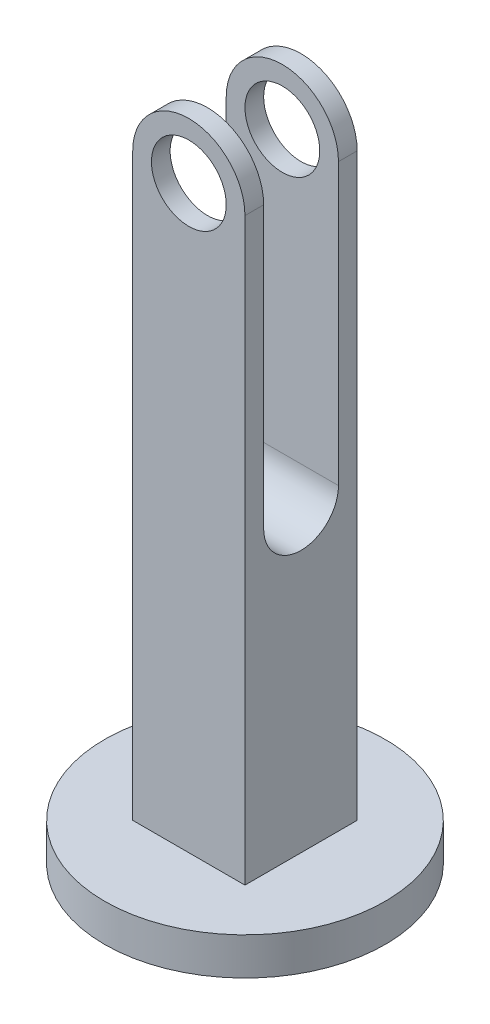
ISO-10303-21;
HEADER;
FILE_DESCRIPTION(('STEP AP214'),'2;1');
FILE_NAME('part.step','',(''),(''),'','','');
FILE_SCHEMA(('AUTOMOTIVE_DESIGN { 1 0 10303 214 1 1 1 1 }'));
ENDSEC;
DATA;
#1=APPLICATION_CONTEXT('core data for automotive mechanical design processes');
#2=APPLICATION_PROTOCOL_DEFINITION('international standard','automotive_design',2000,#1);
#3=PRODUCT_CONTEXT('',#1,'mechanical');
#4=PRODUCT('Part','Part','',(#3));
#5=PRODUCT_RELATED_PRODUCT_CATEGORY('part','',(#4));
#6=PRODUCT_DEFINITION_FORMATION('','',#4);
#7=PRODUCT_DEFINITION_CONTEXT('part definition',#1,'design');
#8=PRODUCT_DEFINITION('design','',#6,#7);
#9=PRODUCT_DEFINITION_SHAPE('','',#8);
#10=(LENGTH_UNIT() NAMED_UNIT(*) SI_UNIT(.MILLI.,.METRE.));
#11=(NAMED_UNIT(*) PLANE_ANGLE_UNIT() SI_UNIT($,.RADIAN.));
#12=(NAMED_UNIT(*) SI_UNIT($,.STERADIAN.) SOLID_ANGLE_UNIT());
#13=UNCERTAINTY_MEASURE_WITH_UNIT(LENGTH_MEASURE(1.E-05),#10,'distance_accuracy_value','');
#14=(GEOMETRIC_REPRESENTATION_CONTEXT(3) GLOBAL_UNCERTAINTY_ASSIGNED_CONTEXT((#13)) GLOBAL_UNIT_ASSIGNED_CONTEXT((#10,
#11,#12)) REPRESENTATION_CONTEXT('',''));
#15=CARTESIAN_POINT('',(0.,0.,0.));
#16=DIRECTION('',(0.,0.,1.));
#17=DIRECTION('',(1.,0.,0.));
#18=AXIS2_PLACEMENT_3D('',#15,#16,#17);
#19=CARTESIAN_POINT('',(0.,360.,30.));
#20=DIRECTION('',(0.,0.,-1.));
#21=DIRECTION('',(-1.,0.,0.));
#22=AXIS2_PLACEMENT_3D('',#19,#20,#21);
#23=PLANE('',#22);
#24=CARTESIAN_POINT('',(0.,330.,30.));
#25=DIRECTION('',(0.,0.,1.));
#26=DIRECTION('',(1.,0.,0.));
#27=AXIS2_PLACEMENT_3D('',#24,#25,#26);
#28=CIRCLE('',#27,20.);
#29=CARTESIAN_POINT('',(20.,330.,30.));
#30=VERTEX_POINT('',#29);
#31=EDGE_CURVE('E190',#30,#30,#28,.T.);
#32=ORIENTED_EDGE('',*,*,#31,.F.);
#33=EDGE_LOOP('',(#32));
#34=FACE_BOUND('',#33,.T.);
#35=CARTESIAN_POINT('',(0.,330.,30.));
#36=DIRECTION('',(0.,0.,1.));
#37=DIRECTION('',(1.,0.,0.));
#38=AXIS2_PLACEMENT_3D('',#35,#36,#37);
#39=CIRCLE('',#38,30.);
#40=CARTESIAN_POINT('',(-30.,330.,30.));
#41=VERTEX_POINT('',#40);
#42=CARTESIAN_POINT('',(30.,330.,30.));
#43=VERTEX_POINT('',#42);
#44=EDGE_CURVE('E142',#41,#43,#39,.F.);
#45=ORIENTED_EDGE('',*,*,#44,.F.);
#46=DIRECTION('',(0.,-1.,0.));
#47=VECTOR('',#46,1.);
#48=CARTESIAN_POINT('',(-30.,360.,30.));
#49=LINE('',#48,#47);
#50=CARTESIAN_POINT('',(-30.,20.0000000000001,30.));
#51=VERTEX_POINT('',#50);
#52=EDGE_CURVE('E146',#41,#51,#49,.T.);
#53=ORIENTED_EDGE('',*,*,#52,.T.);
#54=DIRECTION('',(1.,0.,0.));
#55=VECTOR('',#54,1.);
#56=CARTESIAN_POINT('',(-30.,20.,30.));
#57=LINE('',#56,#55);
#58=CARTESIAN_POINT('',(30.,20.,30.));
#59=VERTEX_POINT('',#58);
#60=EDGE_CURVE('E179',#51,#59,#57,.T.);
#61=ORIENTED_EDGE('',*,*,#60,.T.);
#62=DIRECTION('',(0.,-1.,0.));
#63=VECTOR('',#62,1.);
#64=CARTESIAN_POINT('',(30.,360.,30.));
#65=LINE('',#64,#63);
#66=EDGE_CURVE('E101',#43,#59,#65,.T.);
#67=ORIENTED_EDGE('',*,*,#66,.F.);
#68=EDGE_LOOP('',(#45,#53,#61,#67));
#69=FACE_BOUND('',#68,.T.);
#70=ADVANCED_FACE('F79',(#34,#69),#23,.F.);
#71=CARTESIAN_POINT('',(0.,360.,-30.));
#72=DIRECTION('',(0.,0.,-1.));
#73=DIRECTION('',(-1.,0.,0.));
#74=AXIS2_PLACEMENT_3D('',#71,#72,#73);
#75=PLANE('',#74);
#76=CARTESIAN_POINT('',(0.,330.,-30.));
#77=DIRECTION('',(0.,0.,-1.));
#78=DIRECTION('',(-1.,0.,0.));
#79=AXIS2_PLACEMENT_3D('',#76,#77,#78);
#80=CIRCLE('',#79,20.);
#81=CARTESIAN_POINT('',(-20.,330.,-30.));
#82=VERTEX_POINT('',#81);
#83=EDGE_CURVE('E194',#82,#82,#80,.T.);
#84=ORIENTED_EDGE('',*,*,#83,.F.);
#85=EDGE_LOOP('',(#84));
#86=FACE_BOUND('',#85,.T.);
#87=DIRECTION('',(0.,-1.,0.));
#88=VECTOR('',#87,1.);
#89=CARTESIAN_POINT('',(-30.,360.,-30.));
#90=LINE('',#89,#88);
#91=CARTESIAN_POINT('',(-30.,330.,-30.));
#92=VERTEX_POINT('',#91);
#93=CARTESIAN_POINT('',(-30.,20.,-30.));
#94=VERTEX_POINT('',#93);
#95=EDGE_CURVE('E162',#92,#94,#90,.T.);
#96=ORIENTED_EDGE('',*,*,#95,.F.);
#97=CARTESIAN_POINT('',(0.,330.,-30.));
#98=DIRECTION('',(0.,0.,-1.));
#99=DIRECTION('',(-1.,0.,0.));
#100=AXIS2_PLACEMENT_3D('',#97,#98,#99);
#101=CIRCLE('',#100,30.);
#102=CARTESIAN_POINT('',(30.,330.,-30.));
#103=VERTEX_POINT('',#102);
#104=EDGE_CURVE('E207',#103,#92,#101,.F.);
#105=ORIENTED_EDGE('',*,*,#104,.F.);
#106=DIRECTION('',(0.,-1.,0.));
#107=VECTOR('',#106,1.);
#108=CARTESIAN_POINT('',(30.,360.,-30.));
#109=LINE('',#108,#107);
#110=CARTESIAN_POINT('',(30.,20.,-30.));
#111=VERTEX_POINT('',#110);
#112=EDGE_CURVE('E165',#103,#111,#109,.T.);
#113=ORIENTED_EDGE('',*,*,#112,.T.);
#114=DIRECTION('',(-1.,0.,0.));
#115=VECTOR('',#114,1.);
#116=CARTESIAN_POINT('',(-30.,20.,-30.));
#117=LINE('',#116,#115);
#118=EDGE_CURVE('E175',#111,#94,#117,.T.);
#119=ORIENTED_EDGE('',*,*,#118,.T.);
#120=EDGE_LOOP('',(#96,#105,#113,#119));
#121=FACE_BOUND('',#120,.T.);
#122=ADVANCED_FACE('F243',(#86,#121),#75,.T.);
#123=CARTESIAN_POINT('',(-30.,360.,0.));
#124=DIRECTION('',(-1.,0.,0.));
#125=DIRECTION('',(0.,0.,1.));
#126=AXIS2_PLACEMENT_3D('',#123,#124,#125);
#127=PLANE('',#126);
#128=ORIENTED_EDGE('',*,*,#52,.F.);
#129=DIRECTION('',(0.,0.,1.));
#130=VECTOR('',#129,1.);
#131=CARTESIAN_POINT('',(-30.,330.,-75.));
#132=LINE('',#131,#130);
#133=CARTESIAN_POINT('',(-30.,330.,20.));
#134=VERTEX_POINT('',#133);
#135=EDGE_CURVE('E151',#134,#41,#132,.T.);
#136=ORIENTED_EDGE('',*,*,#135,.F.);
#137=DIRECTION('',(0.,1.,0.));
#138=VECTOR('',#137,1.);
#139=CARTESIAN_POINT('',(-30.,360.,20.));
#140=LINE('',#139,#138);
#141=CARTESIAN_POINT('',(-30.,180.,20.));
#142=VERTEX_POINT('',#141);
#143=EDGE_CURVE('E163',#142,#134,#140,.T.);
#144=ORIENTED_EDGE('',*,*,#143,.F.);
#145=CARTESIAN_POINT('',(-30.,180.,0.));
#146=DIRECTION('',(-1.,0.,0.));
#147=DIRECTION('',(0.,0.,1.));
#148=AXIS2_PLACEMENT_3D('',#145,#146,#147);
#149=CIRCLE('',#148,20.);
#150=CARTESIAN_POINT('',(-30.,180.,-20.));
#151=VERTEX_POINT('',#150);
#152=EDGE_CURVE('E87',#151,#142,#149,.T.);
#153=ORIENTED_EDGE('',*,*,#152,.F.);
#154=DIRECTION('',(0.,-1.,0.));
#155=VECTOR('',#154,1.);
#156=CARTESIAN_POINT('',(-30.,360.,-20.));
#157=LINE('',#156,#155);
#158=CARTESIAN_POINT('',(-30.,330.,-20.));
#159=VERTEX_POINT('',#158);
#160=EDGE_CURVE('E167',#159,#151,#157,.T.);
#161=ORIENTED_EDGE('',*,*,#160,.F.);
#162=EDGE_CURVE('E148',#92,#159,#132,.T.);
#163=ORIENTED_EDGE('',*,*,#162,.F.);
#164=ORIENTED_EDGE('',*,*,#95,.T.);
#165=DIRECTION('',(0.,0.,1.));
#166=VECTOR('',#165,1.);
#167=CARTESIAN_POINT('',(-30.,20.,30.));
#168=LINE('',#167,#166);
#169=EDGE_CURVE('E161',#94,#51,#168,.T.);
#170=ORIENTED_EDGE('',*,*,#169,.T.);
#171=EDGE_LOOP('',(#128,#136,#144,#153,#161,#163,#164,#170));
#172=FACE_BOUND('',#171,.T.);
#173=ADVANCED_FACE('F159',(#172),#127,.T.);
#174=CARTESIAN_POINT('',(-75.,360.,20.));
#175=DIRECTION('',(0.,0.,1.));
#176=DIRECTION('',(1.,0.,0.));
#177=AXIS2_PLACEMENT_3D('',#174,#175,#176);
#178=PLANE('',#177);
#179=CARTESIAN_POINT('',(0.,330.,20.));
#180=DIRECTION('',(0.,0.,1.));
#181=DIRECTION('',(1.,0.,0.));
#182=AXIS2_PLACEMENT_3D('',#179,#180,#181);
#183=CIRCLE('',#182,20.);
#184=CARTESIAN_POINT('',(20.,330.,20.));
#185=VERTEX_POINT('',#184);
#186=EDGE_CURVE('E189',#185,#185,#183,.T.);
#187=ORIENTED_EDGE('',*,*,#186,.T.);
#188=EDGE_LOOP('',(#187));
#189=FACE_BOUND('',#188,.T.);
#190=ORIENTED_EDGE('',*,*,#143,.T.);
#191=CARTESIAN_POINT('',(0.,330.,20.));
#192=DIRECTION('',(0.,0.,1.));
#193=DIRECTION('',(1.,0.,0.));
#194=AXIS2_PLACEMENT_3D('',#191,#192,#193);
#195=CIRCLE('',#194,30.);
#196=CARTESIAN_POINT('',(30.,330.,20.));
#197=VERTEX_POINT('',#196);
#198=EDGE_CURVE('E153',#134,#197,#195,.F.);
#199=ORIENTED_EDGE('',*,*,#198,.T.);
#200=DIRECTION('',(0.,-1.,0.));
#201=VECTOR('',#200,1.);
#202=CARTESIAN_POINT('',(30.,360.,20.));
#203=LINE('',#202,#201);
#204=CARTESIAN_POINT('',(30.,180.,20.));
#205=VERTEX_POINT('',#204);
#206=EDGE_CURVE('E209',#197,#205,#203,.T.);
#207=ORIENTED_EDGE('',*,*,#206,.T.);
#208=DIRECTION('',(1.,0.,0.));
#209=VECTOR('',#208,1.);
#210=CARTESIAN_POINT('',(-75.,180.,20.));
#211=LINE('',#210,#209);
#212=EDGE_CURVE('E217',#142,#205,#211,.T.);
#213=ORIENTED_EDGE('',*,*,#212,.F.);
#214=EDGE_LOOP('',(#190,#199,#207,#213));
#215=FACE_BOUND('',#214,.T.);
#216=ADVANCED_FACE('F234',(#189,#215),#178,.F.);
#217=CARTESIAN_POINT('',(-75.,360.,-20.));
#218=DIRECTION('',(0.,0.,-1.));
#219=DIRECTION('',(0.,1.,0.));
#220=AXIS2_PLACEMENT_3D('',#217,#218,#219);
#221=PLANE('',#220);
#222=CARTESIAN_POINT('',(0.,330.,-20.));
#223=DIRECTION('',(0.,0.,-1.));
#224=DIRECTION('',(0.,1.,0.));
#225=AXIS2_PLACEMENT_3D('',#222,#223,#224);
#226=CIRCLE('',#225,20.);
#227=CARTESIAN_POINT('',(0.,350.,-20.));
#228=VERTEX_POINT('',#227);
#229=EDGE_CURVE('E187',#228,#228,#226,.T.);
#230=ORIENTED_EDGE('',*,*,#229,.T.);
#231=EDGE_LOOP('',(#230));
#232=FACE_BOUND('',#231,.T.);
#233=CARTESIAN_POINT('',(0.,330.,-20.));
#234=DIRECTION('',(0.,0.,-1.));
#235=DIRECTION('',(0.,1.,0.));
#236=AXIS2_PLACEMENT_3D('',#233,#234,#235);
#237=CIRCLE('',#236,30.);
#238=CARTESIAN_POINT('',(30.,330.,-20.));
#239=VERTEX_POINT('',#238);
#240=EDGE_CURVE('E12',#239,#159,#237,.F.);
#241=ORIENTED_EDGE('',*,*,#240,.T.);
#242=ORIENTED_EDGE('',*,*,#160,.T.);
#243=DIRECTION('',(1.,0.,0.));
#244=VECTOR('',#243,1.);
#245=CARTESIAN_POINT('',(-75.,180.,-20.));
#246=LINE('',#245,#244);
#247=CARTESIAN_POINT('',(30.,180.,-20.));
#248=VERTEX_POINT('',#247);
#249=EDGE_CURVE('E218',#151,#248,#246,.T.);
#250=ORIENTED_EDGE('',*,*,#249,.T.);
#251=DIRECTION('',(0.,1.,0.));
#252=VECTOR('',#251,1.);
#253=CARTESIAN_POINT('',(30.,360.,-20.));
#254=LINE('',#253,#252);
#255=EDGE_CURVE('E214',#248,#239,#254,.T.);
#256=ORIENTED_EDGE('',*,*,#255,.T.);
#257=EDGE_LOOP('',(#241,#242,#250,#256));
#258=FACE_BOUND('',#257,.T.);
#259=ADVANCED_FACE('F224',(#232,#258),#221,.F.);
#260=CARTESIAN_POINT('',(30.,360.,0.));
#261=DIRECTION('',(-1.,0.,0.));
#262=DIRECTION('',(0.,0.,1.));
#263=AXIS2_PLACEMENT_3D('',#260,#261,#262);
#264=PLANE('',#263);
#265=DIRECTION('',(0.,0.,1.));
#266=VECTOR('',#265,1.);
#267=CARTESIAN_POINT('',(30.,330.,-75.));
#268=LINE('',#267,#266);
#269=EDGE_CURVE('E94',#197,#43,#268,.T.);
#270=ORIENTED_EDGE('',*,*,#269,.T.);
#271=ORIENTED_EDGE('',*,*,#66,.T.);
#272=DIRECTION('',(0.,0.,-1.));
#273=VECTOR('',#272,1.);
#274=CARTESIAN_POINT('',(30.,20.,30.));
#275=LINE('',#274,#273);
#276=EDGE_CURVE('E173',#59,#111,#275,.T.);
#277=ORIENTED_EDGE('',*,*,#276,.T.);
#278=ORIENTED_EDGE('',*,*,#112,.F.);
#279=EDGE_CURVE('E197',#103,#239,#268,.T.);
#280=ORIENTED_EDGE('',*,*,#279,.T.);
#281=ORIENTED_EDGE('',*,*,#255,.F.);
#282=CARTESIAN_POINT('',(30.,180.,0.));
#283=DIRECTION('',(1.,0.,0.));
#284=DIRECTION('',(0.,0.,-1.));
#285=AXIS2_PLACEMENT_3D('',#282,#283,#284);
#286=CIRCLE('',#285,20.);
#287=EDGE_CURVE('E211',#205,#248,#286,.T.);
#288=ORIENTED_EDGE('',*,*,#287,.F.);
#289=ORIENTED_EDGE('',*,*,#206,.F.);
#290=EDGE_LOOP('',(#270,#271,#277,#278,#280,#281,#288,#289));
#291=FACE_BOUND('',#290,.T.);
#292=ADVANCED_FACE('F236',(#291),#264,.F.);
#293=CARTESIAN_POINT('',(0.,20.,0.));
#294=DIRECTION('',(0.,1.,0.));
#295=DIRECTION('',(0.,0.,1.));
#296=AXIS2_PLACEMENT_3D('',#293,#294,#295);
#297=PLANE('',#296);
#298=CARTESIAN_POINT('',(0.,20.,0.));
#299=DIRECTION('',(0.,1.,0.));
#300=DIRECTION('',(0.,0.,1.));
#301=AXIS2_PLACEMENT_3D('',#298,#299,#300);
#302=CIRCLE('',#301,75.);
#303=CARTESIAN_POINT('',(0.,20.,75.));
#304=VERTEX_POINT('',#303);
#305=EDGE_CURVE('E182',#304,#304,#302,.T.);
#306=ORIENTED_EDGE('',*,*,#305,.T.);
#307=EDGE_LOOP('',(#306));
#308=FACE_BOUND('',#307,.T.);
#309=ORIENTED_EDGE('',*,*,#118,.F.);
#310=ORIENTED_EDGE('',*,*,#276,.F.);
#311=ORIENTED_EDGE('',*,*,#60,.F.);
#312=ORIENTED_EDGE('',*,*,#169,.F.);
#313=EDGE_LOOP('',(#309,#310,#311,#312));
#314=FACE_BOUND('',#313,.T.);
#315=ADVANCED_FACE('F246',(#308,#314),#297,.T.);
#316=CARTESIAN_POINT('',(0.,0.,0.));
#317=DIRECTION('',(0.,1.,0.));
#318=DIRECTION('',(0.,0.,1.));
#319=AXIS2_PLACEMENT_3D('',#316,#317,#318);
#320=PLANE('',#319);
#321=CARTESIAN_POINT('',(0.,0.,0.));
#322=DIRECTION('',(0.,1.,0.));
#323=DIRECTION('',(0.,0.,1.));
#324=AXIS2_PLACEMENT_3D('',#321,#322,#323);
#325=CIRCLE('',#324,75.);
#326=CARTESIAN_POINT('',(0.,0.,75.));
#327=VERTEX_POINT('',#326);
#328=EDGE_CURVE('E181',#327,#327,#325,.T.);
#329=ORIENTED_EDGE('',*,*,#328,.F.);
#330=EDGE_LOOP('',(#329));
#331=FACE_BOUND('',#330,.T.);
#332=ADVANCED_FACE('F248',(#331),#320,.F.);
#333=CARTESIAN_POINT('',(0.,20.,0.));
#334=DIRECTION('',(0.,-1.,0.));
#335=DIRECTION('',(0.,0.,-1.));
#336=AXIS2_PLACEMENT_3D('',#333,#334,#335);
#337=CYLINDRICAL_SURFACE('',#336,75.);
#338=ORIENTED_EDGE('',*,*,#305,.F.);
#339=EDGE_LOOP('',(#338));
#340=FACE_BOUND('',#339,.T.);
#341=ORIENTED_EDGE('',*,*,#328,.T.);
#342=EDGE_LOOP('',(#341));
#343=FACE_BOUND('',#342,.T.);
#344=ADVANCED_FACE('F81',(#340,#343),#337,.T.);
#345=CARTESIAN_POINT('',(-75.,180.,0.));
#346=DIRECTION('',(1.,0.,0.));
#347=DIRECTION('',(0.,0.,-1.));
#348=AXIS2_PLACEMENT_3D('',#345,#346,#347);
#349=CYLINDRICAL_SURFACE('',#348,20.);
#350=ORIENTED_EDGE('',*,*,#152,.T.);
#351=ORIENTED_EDGE('',*,*,#212,.T.);
#352=ORIENTED_EDGE('',*,*,#287,.T.);
#353=ORIENTED_EDGE('',*,*,#249,.F.);
#354=EDGE_LOOP('',(#350,#351,#352,#353));
#355=FACE_BOUND('',#354,.T.);
#356=ADVANCED_FACE('F229',(#355),#349,.F.);
#357=CARTESIAN_POINT('',(0.,330.,-75.));
#358=DIRECTION('',(0.,0.,1.));
#359=DIRECTION('',(1.,0.,0.));
#360=AXIS2_PLACEMENT_3D('',#357,#358,#359);
#361=CYLINDRICAL_SURFACE('',#360,20.);
#362=ORIENTED_EDGE('',*,*,#83,.T.);
#363=EDGE_LOOP('',(#362));
#364=FACE_BOUND('',#363,.T.);
#365=ORIENTED_EDGE('',*,*,#229,.F.);
#366=EDGE_LOOP('',(#365));
#367=FACE_BOUND('',#366,.T.);
#368=ADVANCED_FACE('F273',(#364,#367),#361,.F.);
#369=CARTESIAN_POINT('',(0.,330.,-75.));
#370=DIRECTION('',(0.,0.,1.));
#371=DIRECTION('',(1.,0.,0.));
#372=AXIS2_PLACEMENT_3D('',#369,#370,#371);
#373=CYLINDRICAL_SURFACE('',#372,30.);
#374=ORIENTED_EDGE('',*,*,#104,.T.);
#375=ORIENTED_EDGE('',*,*,#162,.T.);
#376=ORIENTED_EDGE('',*,*,#240,.F.);
#377=ORIENTED_EDGE('',*,*,#279,.F.);
#378=EDGE_LOOP('',(#374,#375,#376,#377));
#379=FACE_BOUND('',#378,.T.);
#380=ADVANCED_FACE('F240',(#379),#373,.T.);
#381=ORIENTED_EDGE('',*,*,#31,.T.);
#382=EDGE_LOOP('',(#381));
#383=FACE_BOUND('',#382,.T.);
#384=ORIENTED_EDGE('',*,*,#186,.F.);
#385=EDGE_LOOP('',(#384));
#386=FACE_BOUND('',#385,.T.);
#387=ADVANCED_FACE('F276',(#383,#386),#361,.F.);
#388=ORIENTED_EDGE('',*,*,#198,.F.);
#389=ORIENTED_EDGE('',*,*,#135,.T.);
#390=ORIENTED_EDGE('',*,*,#44,.T.);
#391=ORIENTED_EDGE('',*,*,#269,.F.);
#392=EDGE_LOOP('',(#388,#389,#390,#391));
#393=FACE_BOUND('',#392,.T.);
#394=ADVANCED_FACE('F152',(#393),#373,.T.);
#395=CLOSED_SHELL('',(#70,#122,#173,#216,#259,#292,#315,#332,#344,#356,#368,#380,#387,#394));
#396=MANIFOLD_SOLID_BREP('B2',#395);
#397=ADVANCED_BREP_SHAPE_REPRESENTATION('',(#18,#396),#14);
#398=SHAPE_DEFINITION_REPRESENTATION(#9,#397);
ENDSEC;
END-ISO-10303-21;
